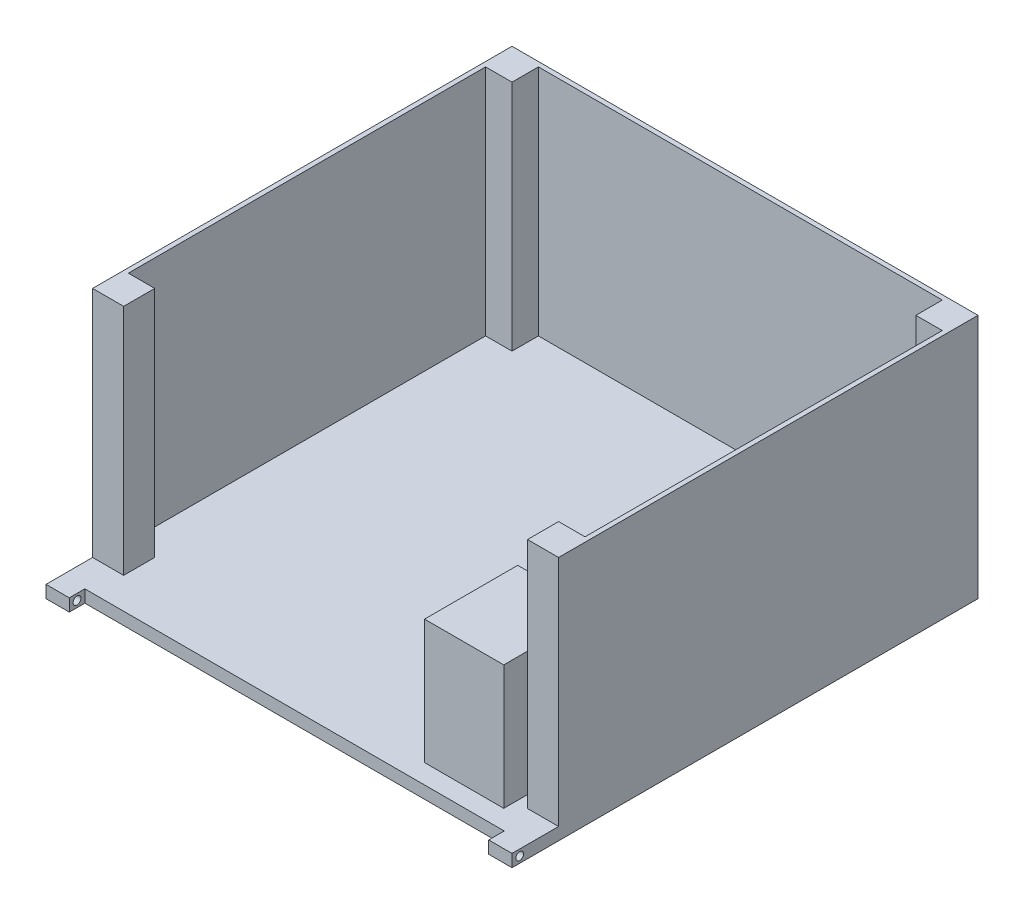
ISO-10303-21;
HEADER;
FILE_DESCRIPTION(('STEP AP214'),'2;1');
FILE_NAME('part.step','',(''),(''),'','','');
FILE_SCHEMA(('AUTOMOTIVE_DESIGN { 1 0 10303 214 1 1 1 1 }'));
ENDSEC;
DATA;
#1=APPLICATION_CONTEXT('core data for automotive mechanical design processes');
#2=APPLICATION_PROTOCOL_DEFINITION('international standard','automotive_design',2000,#1);
#3=PRODUCT_CONTEXT('',#1,'mechanical');
#4=PRODUCT('Part','Part','',(#3));
#5=PRODUCT_RELATED_PRODUCT_CATEGORY('part','',(#4));
#6=PRODUCT_DEFINITION_FORMATION('','',#4);
#7=PRODUCT_DEFINITION_CONTEXT('part definition',#1,'design');
#8=PRODUCT_DEFINITION('design','',#6,#7);
#9=PRODUCT_DEFINITION_SHAPE('','',#8);
#10=(LENGTH_UNIT() NAMED_UNIT(*) SI_UNIT(.MILLI.,.METRE.));
#11=(NAMED_UNIT(*) PLANE_ANGLE_UNIT() SI_UNIT($,.RADIAN.));
#12=(NAMED_UNIT(*) SI_UNIT($,.STERADIAN.) SOLID_ANGLE_UNIT());
#13=UNCERTAINTY_MEASURE_WITH_UNIT(LENGTH_MEASURE(1.E-05),#10,'distance_accuracy_value','');
#14=(GEOMETRIC_REPRESENTATION_CONTEXT(3) GLOBAL_UNCERTAINTY_ASSIGNED_CONTEXT((#13)) GLOBAL_UNIT_ASSIGNED_CONTEXT((#10,
#11,#12)) REPRESENTATION_CONTEXT('',''));
#15=CARTESIAN_POINT('',(0.,0.,0.));
#16=DIRECTION('',(0.,0.,1.));
#17=DIRECTION('',(1.,0.,0.));
#18=AXIS2_PLACEMENT_3D('',#15,#16,#17);
#19=CARTESIAN_POINT('',(0.,8.,0.));
#20=DIRECTION('',(0.,1.,0.));
#21=DIRECTION('',(0.,0.,1.));
#22=AXIS2_PLACEMENT_3D('',#19,#20,#21);
#23=PLANE('',#22);
#24=DIRECTION('',(1.,0.,0.));
#25=VECTOR('',#24,1.);
#26=CARTESIAN_POINT('',(-150.,8.,-130.));
#27=LINE('',#26,#25);
#28=CARTESIAN_POINT('',(-147.,8.,-130.));
#29=VERTEX_POINT('',#28);
#30=CARTESIAN_POINT('',(-130.,8.,-130.));
#31=VERTEX_POINT('',#30);
#32=EDGE_CURVE('E375',#29,#31,#27,.T.);
#33=ORIENTED_EDGE('',*,*,#32,.F.);
#34=DIRECTION('',(0.,0.,-1.));
#35=VECTOR('',#34,1.);
#36=CARTESIAN_POINT('',(-147.,8.,-147.));
#37=LINE('',#36,#35);
#38=CARTESIAN_POINT('',(-147.,8.,100.));
#39=VERTEX_POINT('',#38);
#40=EDGE_CURVE('E243',#39,#29,#37,.T.);
#41=ORIENTED_EDGE('',*,*,#40,.F.);
#42=DIRECTION('',(-1.,0.,0.));
#43=VECTOR('',#42,1.);
#44=CARTESIAN_POINT('',(-150.,8.,100.));
#45=LINE('',#44,#43);
#46=CARTESIAN_POINT('',(-130.,8.,100.));
#47=VERTEX_POINT('',#46);
#48=EDGE_CURVE('E291',#47,#39,#45,.T.);
#49=ORIENTED_EDGE('',*,*,#48,.F.);
#50=DIRECTION('',(0.,0.,-1.));
#51=VECTOR('',#50,1.);
#52=CARTESIAN_POINT('',(-130.,8.,120.));
#53=LINE('',#52,#51);
#54=CARTESIAN_POINT('',(-130.,8.,120.));
#55=VERTEX_POINT('',#54);
#56=EDGE_CURVE('E302',#55,#47,#53,.T.);
#57=ORIENTED_EDGE('',*,*,#56,.F.);
#58=DIRECTION('',(1.,0.,0.));
#59=VECTOR('',#58,1.);
#60=CARTESIAN_POINT('',(-150.,8.,120.));
#61=LINE('',#60,#59);
#62=CARTESIAN_POINT('',(-150.,8.,120.));
#63=VERTEX_POINT('',#62);
#64=EDGE_CURVE('E285',#63,#55,#61,.T.);
#65=ORIENTED_EDGE('',*,*,#64,.F.);
#66=DIRECTION('',(0.,0.,1.));
#67=VECTOR('',#66,1.);
#68=CARTESIAN_POINT('',(-150.,8.,-150.));
#69=LINE('',#68,#67);
#70=CARTESIAN_POINT('',(-150.,8.,150.));
#71=VERTEX_POINT('',#70);
#72=EDGE_CURVE('E416',#63,#71,#69,.T.);
#73=ORIENTED_EDGE('',*,*,#72,.T.);
#74=DIRECTION('',(1.,0.,0.));
#75=VECTOR('',#74,1.);
#76=CARTESIAN_POINT('',(-150.,8.,150.));
#77=LINE('',#76,#75);
#78=CARTESIAN_POINT('',(-135.,8.,150.));
#79=VERTEX_POINT('',#78);
#80=EDGE_CURVE('E420',#71,#79,#77,.T.);
#81=ORIENTED_EDGE('',*,*,#80,.T.);
#82=DIRECTION('',(0.,0.,-1.));
#83=VECTOR('',#82,1.);
#84=CARTESIAN_POINT('',(-135.,8.,140.));
#85=LINE('',#84,#83);
#86=CARTESIAN_POINT('',(-135.,8.,140.));
#87=VERTEX_POINT('',#86);
#88=EDGE_CURVE('E423',#79,#87,#85,.T.);
#89=ORIENTED_EDGE('',*,*,#88,.T.);
#90=DIRECTION('',(1.,0.,0.));
#91=VECTOR('',#90,1.);
#92=CARTESIAN_POINT('',(-135.,8.,140.));
#93=LINE('',#92,#91);
#94=CARTESIAN_POINT('',(135.,8.,140.));
#95=VERTEX_POINT('',#94);
#96=EDGE_CURVE('E426',#87,#95,#93,.T.);
#97=ORIENTED_EDGE('',*,*,#96,.T.);
#98=DIRECTION('',(0.,0.,1.));
#99=VECTOR('',#98,1.);
#100=CARTESIAN_POINT('',(135.,8.,140.));
#101=LINE('',#100,#99);
#102=CARTESIAN_POINT('',(135.,8.,150.));
#103=VERTEX_POINT('',#102);
#104=EDGE_CURVE('E429',#95,#103,#101,.T.);
#105=ORIENTED_EDGE('',*,*,#104,.T.);
#106=DIRECTION('',(1.,0.,0.));
#107=VECTOR('',#106,1.);
#108=CARTESIAN_POINT('',(135.,8.,150.));
#109=LINE('',#108,#107);
#110=CARTESIAN_POINT('',(150.,8.,150.));
#111=VERTEX_POINT('',#110);
#112=EDGE_CURVE('E432',#103,#111,#109,.T.);
#113=ORIENTED_EDGE('',*,*,#112,.T.);
#114=DIRECTION('',(0.,0.,-1.));
#115=VECTOR('',#114,1.);
#116=CARTESIAN_POINT('',(150.,8.,-150.));
#117=LINE('',#116,#115);
#118=CARTESIAN_POINT('',(150.,8.,120.));
#119=VERTEX_POINT('',#118);
#120=EDGE_CURVE('E413',#111,#119,#117,.T.);
#121=ORIENTED_EDGE('',*,*,#120,.T.);
#122=DIRECTION('',(1.,0.,0.));
#123=VECTOR('',#122,1.);
#124=CARTESIAN_POINT('',(150.,8.,120.));
#125=LINE('',#124,#123);
#126=CARTESIAN_POINT('',(130.,8.,120.));
#127=VERTEX_POINT('',#126);
#128=EDGE_CURVE('E325',#127,#119,#125,.T.);
#129=ORIENTED_EDGE('',*,*,#128,.F.);
#130=DIRECTION('',(0.,0.,1.));
#131=VECTOR('',#130,1.);
#132=CARTESIAN_POINT('',(130.,8.,120.));
#133=LINE('',#132,#131);
#134=CARTESIAN_POINT('',(130.,8.,100.));
#135=VERTEX_POINT('',#134);
#136=EDGE_CURVE('E335',#135,#127,#133,.T.);
#137=ORIENTED_EDGE('',*,*,#136,.F.);
#138=DIRECTION('',(-1.,0.,0.));
#139=VECTOR('',#138,1.);
#140=CARTESIAN_POINT('',(150.,8.,100.));
#141=LINE('',#140,#139);
#142=CARTESIAN_POINT('',(147.,8.,100.));
#143=VERTEX_POINT('',#142);
#144=EDGE_CURVE('E320',#143,#135,#141,.T.);
#145=ORIENTED_EDGE('',*,*,#144,.F.);
#146=DIRECTION('',(0.,0.,1.));
#147=VECTOR('',#146,1.);
#148=CARTESIAN_POINT('',(147.,8.,-147.));
#149=LINE('',#148,#147);
#150=CARTESIAN_POINT('',(147.,8.,-130.));
#151=VERTEX_POINT('',#150);
#152=EDGE_CURVE('E256',#151,#143,#149,.T.);
#153=ORIENTED_EDGE('',*,*,#152,.F.);
#154=DIRECTION('',(1.,0.,0.));
#155=VECTOR('',#154,1.);
#156=CARTESIAN_POINT('',(150.,8.,-130.));
#157=LINE('',#156,#155);
#158=CARTESIAN_POINT('',(130.,8.,-130.));
#159=VERTEX_POINT('',#158);
#160=EDGE_CURVE('E358',#159,#151,#157,.T.);
#161=ORIENTED_EDGE('',*,*,#160,.F.);
#162=DIRECTION('',(0.,0.,1.));
#163=VECTOR('',#162,1.);
#164=CARTESIAN_POINT('',(130.,8.,-150.));
#165=LINE('',#164,#163);
#166=CARTESIAN_POINT('',(130.,8.,-147.));
#167=VERTEX_POINT('',#166);
#168=EDGE_CURVE('E353',#167,#159,#165,.T.);
#169=ORIENTED_EDGE('',*,*,#168,.F.);
#170=DIRECTION('',(1.,0.,0.));
#171=VECTOR('',#170,1.);
#172=CARTESIAN_POINT('',(-147.,8.,-147.));
#173=LINE('',#172,#171);
#174=CARTESIAN_POINT('',(-130.,8.,-147.));
#175=VERTEX_POINT('',#174);
#176=EDGE_CURVE('E247',#175,#167,#173,.T.);
#177=ORIENTED_EDGE('',*,*,#176,.F.);
#178=DIRECTION('',(0.,0.,-1.));
#179=VECTOR('',#178,1.);
#180=CARTESIAN_POINT('',(-130.,8.,-150.));
#181=LINE('',#180,#179);
#182=EDGE_CURVE('E380',#31,#175,#181,.T.);
#183=ORIENTED_EDGE('',*,*,#182,.F.);
#184=EDGE_LOOP('',(#33,#41,#49,#57,#65,#73,#81,#89,#97,#105,#113,#121,#129,#137,#145,#153,#161,
#169,#177,#183));
#185=FACE_BOUND('',#184,.T.);
#186=DIRECTION('',(1.,0.,0.));
#187=VECTOR('',#186,1.);
#188=CARTESIAN_POINT('',(71.2296896432998,8.,127.534797700735));
#189=LINE('',#188,#187);
#190=CARTESIAN_POINT('',(71.2296896432998,8.,127.534797700735));
#191=VERTEX_POINT('',#190);
#192=CARTESIAN_POINT('',(122.2296896433,8.,127.534797700735));
#193=VERTEX_POINT('',#192);
#194=EDGE_CURVE('E914',#191,#193,#189,.T.);
#195=ORIENTED_EDGE('',*,*,#194,.F.);
#196=DIRECTION('',(0.,0.,1.));
#197=VECTOR('',#196,1.);
#198=CARTESIAN_POINT('',(71.2296896432998,8.,67.534797700735));
#199=LINE('',#198,#197);
#200=CARTESIAN_POINT('',(71.2296896432998,8.,67.534797700735));
#201=VERTEX_POINT('',#200);
#202=EDGE_CURVE('E240',#201,#191,#199,.T.);
#203=ORIENTED_EDGE('',*,*,#202,.F.);
#204=DIRECTION('',(-1.,0.,0.));
#205=VECTOR('',#204,1.);
#206=CARTESIAN_POINT('',(71.2296896432998,8.,67.534797700735));
#207=LINE('',#206,#205);
#208=CARTESIAN_POINT('',(122.2296896433,8.,67.534797700735));
#209=VERTEX_POINT('',#208);
#210=EDGE_CURVE('E236',#209,#201,#207,.T.);
#211=ORIENTED_EDGE('',*,*,#210,.F.);
#212=DIRECTION('',(0.,0.,-1.));
#213=VECTOR('',#212,1.);
#214=CARTESIAN_POINT('',(122.2296896433,8.,67.534797700735));
#215=LINE('',#214,#213);
#216=EDGE_CURVE('E924',#193,#209,#215,.T.);
#217=ORIENTED_EDGE('',*,*,#216,.F.);
#218=EDGE_LOOP('',(#195,#203,#211,#217));
#219=FACE_BOUND('',#218,.T.);
#220=ADVANCED_FACE('F41',(#185,#219),#23,.T.);
#221=CARTESIAN_POINT('',(-150.,158.,-130.));
#222=DIRECTION('',(0.,0.,-1.));
#223=DIRECTION('',(-1.,0.,0.));
#224=AXIS2_PLACEMENT_3D('',#221,#222,#223);
#225=PLANE('',#224);
#226=DIRECTION('',(0.,1.,0.));
#227=VECTOR('',#226,1.);
#228=CARTESIAN_POINT('',(-147.,158.,-130.));
#229=LINE('',#228,#227);
#230=CARTESIAN_POINT('',(-147.,158.,-130.));
#231=VERTEX_POINT('',#230);
#232=EDGE_CURVE('E269',#29,#231,#229,.T.);
#233=ORIENTED_EDGE('',*,*,#232,.F.);
#234=ORIENTED_EDGE('',*,*,#32,.T.);
#235=DIRECTION('',(0.,-1.,0.));
#236=VECTOR('',#235,1.);
#237=CARTESIAN_POINT('',(-130.,158.,-130.));
#238=LINE('',#237,#236);
#239=CARTESIAN_POINT('',(-130.,158.,-130.));
#240=VERTEX_POINT('',#239);
#241=EDGE_CURVE('E390',#240,#31,#238,.T.);
#242=ORIENTED_EDGE('',*,*,#241,.F.);
#243=DIRECTION('',(1.,0.,0.));
#244=VECTOR('',#243,1.);
#245=CARTESIAN_POINT('',(-150.,158.,-130.));
#246=LINE('',#245,#244);
#247=EDGE_CURVE('E379',#231,#240,#246,.T.);
#248=ORIENTED_EDGE('',*,*,#247,.F.);
#249=EDGE_LOOP('',(#233,#234,#242,#248));
#250=FACE_BOUND('',#249,.T.);
#251=ADVANCED_FACE('F512',(#250),#225,.F.);
#252=CARTESIAN_POINT('',(-130.,158.,-150.));
#253=DIRECTION('',(-1.,0.,0.));
#254=DIRECTION('',(0.,0.,1.));
#255=AXIS2_PLACEMENT_3D('',#252,#253,#254);
#256=PLANE('',#255);
#257=DIRECTION('',(0.,-1.,0.));
#258=VECTOR('',#257,1.);
#259=CARTESIAN_POINT('',(-130.,158.,-147.));
#260=LINE('',#259,#258);
#261=CARTESIAN_POINT('',(-130.,158.,-147.));
#262=VERTEX_POINT('',#261);
#263=EDGE_CURVE('E282',#262,#175,#260,.T.);
#264=ORIENTED_EDGE('',*,*,#263,.F.);
#265=DIRECTION('',(0.,0.,-1.));
#266=VECTOR('',#265,1.);
#267=CARTESIAN_POINT('',(-130.,158.,-150.));
#268=LINE('',#267,#266);
#269=EDGE_CURVE('E383',#240,#262,#268,.T.);
#270=ORIENTED_EDGE('',*,*,#269,.F.);
#271=ORIENTED_EDGE('',*,*,#241,.T.);
#272=ORIENTED_EDGE('',*,*,#182,.T.);
#273=EDGE_LOOP('',(#264,#270,#271,#272));
#274=FACE_BOUND('',#273,.T.);
#275=ADVANCED_FACE('F519',(#274),#256,.F.);
#276=CARTESIAN_POINT('',(130.,158.,-150.));
#277=DIRECTION('',(1.,0.,0.));
#278=DIRECTION('',(0.,0.,-1.));
#279=AXIS2_PLACEMENT_3D('',#276,#277,#278);
#280=PLANE('',#279);
#281=DIRECTION('',(0.,1.,0.));
#282=VECTOR('',#281,1.);
#283=CARTESIAN_POINT('',(130.,158.,-147.));
#284=LINE('',#283,#282);
#285=CARTESIAN_POINT('',(130.,158.,-147.));
#286=VERTEX_POINT('',#285);
#287=EDGE_CURVE('E279',#167,#286,#284,.T.);
#288=ORIENTED_EDGE('',*,*,#287,.F.);
#289=ORIENTED_EDGE('',*,*,#168,.T.);
#290=DIRECTION('',(0.,-1.,0.));
#291=VECTOR('',#290,1.);
#292=CARTESIAN_POINT('',(130.,158.,-130.));
#293=LINE('',#292,#291);
#294=CARTESIAN_POINT('',(130.,158.,-130.));
#295=VERTEX_POINT('',#294);
#296=EDGE_CURVE('E366',#295,#159,#293,.T.);
#297=ORIENTED_EDGE('',*,*,#296,.F.);
#298=DIRECTION('',(0.,0.,1.));
#299=VECTOR('',#298,1.);
#300=CARTESIAN_POINT('',(130.,158.,-150.));
#301=LINE('',#300,#299);
#302=EDGE_CURVE('E354',#286,#295,#301,.T.);
#303=ORIENTED_EDGE('',*,*,#302,.F.);
#304=EDGE_LOOP('',(#288,#289,#297,#303));
#305=FACE_BOUND('',#304,.T.);
#306=ADVANCED_FACE('F612',(#305),#280,.F.);
#307=CARTESIAN_POINT('',(150.,158.,-130.));
#308=DIRECTION('',(0.,0.,-1.));
#309=DIRECTION('',(-1.,0.,0.));
#310=AXIS2_PLACEMENT_3D('',#307,#308,#309);
#311=PLANE('',#310);
#312=DIRECTION('',(0.,-1.,0.));
#313=VECTOR('',#312,1.);
#314=CARTESIAN_POINT('',(147.,158.,-130.));
#315=LINE('',#314,#313);
#316=CARTESIAN_POINT('',(147.,158.,-130.));
#317=VERTEX_POINT('',#316);
#318=EDGE_CURVE('E276',#317,#151,#315,.T.);
#319=ORIENTED_EDGE('',*,*,#318,.F.);
#320=DIRECTION('',(1.,0.,0.));
#321=VECTOR('',#320,1.);
#322=CARTESIAN_POINT('',(150.,158.,-130.));
#323=LINE('',#322,#321);
#324=EDGE_CURVE('E357',#295,#317,#323,.T.);
#325=ORIENTED_EDGE('',*,*,#324,.F.);
#326=ORIENTED_EDGE('',*,*,#296,.T.);
#327=ORIENTED_EDGE('',*,*,#160,.T.);
#328=EDGE_LOOP('',(#319,#325,#326,#327));
#329=FACE_BOUND('',#328,.T.);
#330=ADVANCED_FACE('F617',(#329),#311,.F.);
#331=CARTESIAN_POINT('',(150.,158.,100.));
#332=DIRECTION('',(0.,0.,1.));
#333=DIRECTION('',(1.,0.,0.));
#334=AXIS2_PLACEMENT_3D('',#331,#332,#333);
#335=PLANE('',#334);
#336=DIRECTION('',(0.,1.,0.));
#337=VECTOR('',#336,1.);
#338=CARTESIAN_POINT('',(147.,158.,100.));
#339=LINE('',#338,#337);
#340=CARTESIAN_POINT('',(147.,158.,100.));
#341=VERTEX_POINT('',#340);
#342=EDGE_CURVE('E272',#143,#341,#339,.T.);
#343=ORIENTED_EDGE('',*,*,#342,.F.);
#344=ORIENTED_EDGE('',*,*,#144,.T.);
#345=DIRECTION('',(0.,-1.,0.));
#346=VECTOR('',#345,1.);
#347=CARTESIAN_POINT('',(130.,158.,100.));
#348=LINE('',#347,#346);
#349=CARTESIAN_POINT('',(130.,158.,100.));
#350=VERTEX_POINT('',#349);
#351=EDGE_CURVE('E349',#350,#135,#348,.T.);
#352=ORIENTED_EDGE('',*,*,#351,.F.);
#353=DIRECTION('',(-1.,0.,0.));
#354=VECTOR('',#353,1.);
#355=CARTESIAN_POINT('',(150.,158.,100.));
#356=LINE('',#355,#354);
#357=EDGE_CURVE('E321',#341,#350,#356,.T.);
#358=ORIENTED_EDGE('',*,*,#357,.F.);
#359=EDGE_LOOP('',(#343,#344,#352,#358));
#360=FACE_BOUND('',#359,.T.);
#361=ADVANCED_FACE('F624',(#360),#335,.F.);
#362=CARTESIAN_POINT('',(-150.,158.,100.));
#363=DIRECTION('',(0.,0.,1.));
#364=DIRECTION('',(1.,0.,0.));
#365=AXIS2_PLACEMENT_3D('',#362,#363,#364);
#366=PLANE('',#365);
#367=DIRECTION('',(0.,-1.,0.));
#368=VECTOR('',#367,1.);
#369=CARTESIAN_POINT('',(-147.,158.,100.));
#370=LINE('',#369,#368);
#371=CARTESIAN_POINT('',(-147.,158.,100.));
#372=VERTEX_POINT('',#371);
#373=EDGE_CURVE('E261',#372,#39,#370,.T.);
#374=ORIENTED_EDGE('',*,*,#373,.F.);
#375=DIRECTION('',(-1.,0.,0.));
#376=VECTOR('',#375,1.);
#377=CARTESIAN_POINT('',(-150.,158.,100.));
#378=LINE('',#377,#376);
#379=CARTESIAN_POINT('',(-130.,158.,100.));
#380=VERTEX_POINT('',#379);
#381=EDGE_CURVE('E294',#380,#372,#378,.T.);
#382=ORIENTED_EDGE('',*,*,#381,.F.);
#383=DIRECTION('',(0.,-1.,0.));
#384=VECTOR('',#383,1.);
#385=CARTESIAN_POINT('',(-130.,158.,100.));
#386=LINE('',#385,#384);
#387=EDGE_CURVE('E312',#380,#47,#386,.T.);
#388=ORIENTED_EDGE('',*,*,#387,.T.);
#389=ORIENTED_EDGE('',*,*,#48,.T.);
#390=EDGE_LOOP('',(#374,#382,#388,#389));
#391=FACE_BOUND('',#390,.T.);
#392=ADVANCED_FACE('F550',(#391),#366,.F.);
#393=CARTESIAN_POINT('',(150.,8.,-150.));
#394=DIRECTION('',(-1.,0.,0.));
#395=DIRECTION('',(0.,0.,1.));
#396=AXIS2_PLACEMENT_3D('',#393,#394,#395);
#397=PLANE('',#396);
#398=DIRECTION('',(0.,0.,-1.));
#399=VECTOR('',#398,1.);
#400=CARTESIAN_POINT('',(150.,158.,-150.));
#401=LINE('',#400,#399);
#402=CARTESIAN_POINT('',(150.,158.,120.));
#403=VERTEX_POINT('',#402);
#404=CARTESIAN_POINT('',(150.,158.,-150.));
#405=VERTEX_POINT('',#404);
#406=EDGE_CURVE('E362',#403,#405,#401,.T.);
#407=ORIENTED_EDGE('',*,*,#406,.F.);
#408=DIRECTION('',(0.,-1.,0.));
#409=VECTOR('',#408,1.);
#410=CARTESIAN_POINT('',(150.,158.,120.));
#411=LINE('',#410,#409);
#412=EDGE_CURVE('E332',#403,#119,#411,.T.);
#413=ORIENTED_EDGE('',*,*,#412,.T.);
#414=ORIENTED_EDGE('',*,*,#120,.F.);
#415=DIRECTION('',(0.,-1.,0.));
#416=VECTOR('',#415,1.);
#417=CARTESIAN_POINT('',(150.,8.,150.));
#418=LINE('',#417,#416);
#419=CARTESIAN_POINT('',(150.,0.,150.));
#420=VERTEX_POINT('',#419);
#421=EDGE_CURVE('E435',#111,#420,#418,.T.);
#422=ORIENTED_EDGE('',*,*,#421,.T.);
#423=DIRECTION('',(0.,0.,-1.));
#424=VECTOR('',#423,1.);
#425=CARTESIAN_POINT('',(150.,0.,-150.));
#426=LINE('',#425,#424);
#427=CARTESIAN_POINT('',(150.,0.,-150.));
#428=VERTEX_POINT('',#427);
#429=EDGE_CURVE('E412',#420,#428,#426,.T.);
#430=ORIENTED_EDGE('',*,*,#429,.T.);
#431=DIRECTION('',(0.,-1.,0.));
#432=VECTOR('',#431,1.);
#433=CARTESIAN_POINT('',(150.,8.,-150.));
#434=LINE('',#433,#432);
#435=EDGE_CURVE('E50',#405,#428,#434,.T.);
#436=ORIENTED_EDGE('',*,*,#435,.F.);
#437=EDGE_LOOP('',(#407,#413,#414,#422,#430,#436));
#438=FACE_BOUND('',#437,.T.);
#439=CARTESIAN_POINT('',(150.,4.,145.033528282622));
#440=DIRECTION('',(1.,0.,0.));
#441=DIRECTION('',(0.,0.,-1.));
#442=AXIS2_PLACEMENT_3D('',#439,#440,#441);
#443=CIRCLE('',#442,2.5);
#444=CARTESIAN_POINT('',(150.,4.,142.533528282622));
#445=VERTEX_POINT('',#444);
#446=EDGE_CURVE('E399',#445,#445,#443,.T.);
#447=ORIENTED_EDGE('',*,*,#446,.F.);
#448=EDGE_LOOP('',(#447));
#449=FACE_BOUND('',#448,.T.);
#450=ADVANCED_FACE('F43',(#438,#449),#397,.F.);
#451=CARTESIAN_POINT('',(-150.,8.,-150.));
#452=DIRECTION('',(0.,0.,1.));
#453=DIRECTION('',(1.,0.,0.));
#454=AXIS2_PLACEMENT_3D('',#451,#452,#453);
#455=PLANE('',#454);
#456=DIRECTION('',(-1.,0.,0.));
#457=VECTOR('',#456,1.);
#458=CARTESIAN_POINT('',(-150.,158.,-150.));
#459=LINE('',#458,#457);
#460=CARTESIAN_POINT('',(-150.,158.,-150.));
#461=VERTEX_POINT('',#460);
#462=EDGE_CURVE('E386',#405,#461,#459,.T.);
#463=ORIENTED_EDGE('',*,*,#462,.F.);
#464=ORIENTED_EDGE('',*,*,#435,.T.);
#465=DIRECTION('',(-1.,0.,0.));
#466=VECTOR('',#465,1.);
#467=CARTESIAN_POINT('',(-150.,0.,-150.));
#468=LINE('',#467,#466);
#469=CARTESIAN_POINT('',(-150.,0.,-150.));
#470=VERTEX_POINT('',#469);
#471=EDGE_CURVE('E439',#428,#470,#468,.T.);
#472=ORIENTED_EDGE('',*,*,#471,.T.);
#473=DIRECTION('',(0.,-1.,0.));
#474=VECTOR('',#473,1.);
#475=CARTESIAN_POINT('',(-150.,8.,-150.));
#476=LINE('',#475,#474);
#477=EDGE_CURVE('E483',#461,#470,#476,.T.);
#478=ORIENTED_EDGE('',*,*,#477,.F.);
#479=EDGE_LOOP('',(#463,#464,#472,#478));
#480=FACE_BOUND('',#479,.T.);
#481=ADVANCED_FACE('F543',(#480),#455,.F.);
#482=CARTESIAN_POINT('',(-150.,8.,-150.));
#483=DIRECTION('',(1.,0.,0.));
#484=DIRECTION('',(0.,0.,-1.));
#485=AXIS2_PLACEMENT_3D('',#482,#483,#484);
#486=PLANE('',#485);
#487=DIRECTION('',(0.,-1.,0.));
#488=VECTOR('',#487,1.);
#489=CARTESIAN_POINT('',(-150.,158.,120.));
#490=LINE('',#489,#488);
#491=CARTESIAN_POINT('',(-150.,158.,120.));
#492=VERTEX_POINT('',#491);
#493=EDGE_CURVE('E298',#492,#63,#490,.T.);
#494=ORIENTED_EDGE('',*,*,#493,.F.);
#495=DIRECTION('',(0.,0.,1.));
#496=VECTOR('',#495,1.);
#497=CARTESIAN_POINT('',(-150.,158.,-150.));
#498=LINE('',#497,#496);
#499=EDGE_CURVE('E376',#461,#492,#498,.T.);
#500=ORIENTED_EDGE('',*,*,#499,.F.);
#501=ORIENTED_EDGE('',*,*,#477,.T.);
#502=DIRECTION('',(0.,0.,1.));
#503=VECTOR('',#502,1.);
#504=CARTESIAN_POINT('',(-150.,0.,-150.));
#505=LINE('',#504,#503);
#506=CARTESIAN_POINT('',(-150.,0.,150.));
#507=VERTEX_POINT('',#506);
#508=EDGE_CURVE('E443',#470,#507,#505,.T.);
#509=ORIENTED_EDGE('',*,*,#508,.T.);
#510=DIRECTION('',(0.,-1.,0.));
#511=VECTOR('',#510,1.);
#512=CARTESIAN_POINT('',(-150.,8.,150.));
#513=LINE('',#512,#511);
#514=EDGE_CURVE('E479',#71,#507,#513,.T.);
#515=ORIENTED_EDGE('',*,*,#514,.F.);
#516=ORIENTED_EDGE('',*,*,#72,.F.);
#517=EDGE_LOOP('',(#494,#500,#501,#509,#515,#516));
#518=FACE_BOUND('',#517,.T.);
#519=CARTESIAN_POINT('',(-150.,4.,145.033528282622));
#520=DIRECTION('',(1.,0.,0.));
#521=DIRECTION('',(0.,0.,-1.));
#522=AXIS2_PLACEMENT_3D('',#519,#520,#521);
#523=CIRCLE('',#522,2.5);
#524=CARTESIAN_POINT('',(-150.,4.,142.533528282622));
#525=VERTEX_POINT('',#524);
#526=EDGE_CURVE('E403',#525,#525,#523,.T.);
#527=ORIENTED_EDGE('',*,*,#526,.T.);
#528=EDGE_LOOP('',(#527));
#529=FACE_BOUND('',#528,.T.);
#530=ADVANCED_FACE('F540',(#518,#529),#486,.F.);
#531=CARTESIAN_POINT('',(-150.,8.,150.));
#532=DIRECTION('',(0.,0.,-1.));
#533=DIRECTION('',(-1.,0.,0.));
#534=AXIS2_PLACEMENT_3D('',#531,#532,#533);
#535=PLANE('',#534);
#536=DIRECTION('',(1.,0.,0.));
#537=VECTOR('',#536,1.);
#538=CARTESIAN_POINT('',(-150.,0.,150.));
#539=LINE('',#538,#537);
#540=CARTESIAN_POINT('',(-135.,0.,150.));
#541=VERTEX_POINT('',#540);
#542=EDGE_CURVE('E446',#507,#541,#539,.T.);
#543=ORIENTED_EDGE('',*,*,#542,.T.);
#544=DIRECTION('',(0.,-1.,0.));
#545=VECTOR('',#544,1.);
#546=CARTESIAN_POINT('',(-135.,8.,150.));
#547=LINE('',#546,#545);
#548=EDGE_CURVE('E475',#79,#541,#547,.T.);
#549=ORIENTED_EDGE('',*,*,#548,.F.);
#550=ORIENTED_EDGE('',*,*,#80,.F.);
#551=ORIENTED_EDGE('',*,*,#514,.T.);
#552=EDGE_LOOP('',(#543,#549,#550,#551));
#553=FACE_BOUND('',#552,.T.);
#554=ADVANCED_FACE('F536',(#553),#535,.F.);
#555=CARTESIAN_POINT('',(-135.,8.,140.));
#556=DIRECTION('',(-1.,0.,0.));
#557=DIRECTION('',(0.,0.,1.));
#558=AXIS2_PLACEMENT_3D('',#555,#556,#557);
#559=PLANE('',#558);
#560=CARTESIAN_POINT('',(-135.,4.,145.033528282622));
#561=DIRECTION('',(-1.,0.,0.));
#562=DIRECTION('',(0.,0.,1.));
#563=AXIS2_PLACEMENT_3D('',#560,#561,#562);
#564=CIRCLE('',#563,2.5);
#565=CARTESIAN_POINT('',(-135.,4.,147.533528282622));
#566=VERTEX_POINT('',#565);
#567=EDGE_CURVE('E408',#566,#566,#564,.T.);
#568=ORIENTED_EDGE('',*,*,#567,.T.);
#569=EDGE_LOOP('',(#568));
#570=FACE_BOUND('',#569,.T.);
#571=DIRECTION('',(0.,0.,-1.));
#572=VECTOR('',#571,1.);
#573=CARTESIAN_POINT('',(-135.,0.,140.));
#574=LINE('',#573,#572);
#575=CARTESIAN_POINT('',(-135.,0.,140.));
#576=VERTEX_POINT('',#575);
#577=EDGE_CURVE('E449',#541,#576,#574,.T.);
#578=ORIENTED_EDGE('',*,*,#577,.T.);
#579=DIRECTION('',(0.,-1.,0.));
#580=VECTOR('',#579,1.);
#581=CARTESIAN_POINT('',(-135.,8.,140.));
#582=LINE('',#581,#580);
#583=EDGE_CURVE('E471',#87,#576,#582,.T.);
#584=ORIENTED_EDGE('',*,*,#583,.F.);
#585=ORIENTED_EDGE('',*,*,#88,.F.);
#586=ORIENTED_EDGE('',*,*,#548,.T.);
#587=EDGE_LOOP('',(#578,#584,#585,#586));
#588=FACE_BOUND('',#587,.T.);
#589=ADVANCED_FACE('F532',(#570,#588),#559,.F.);
#590=CARTESIAN_POINT('',(-135.,8.,140.));
#591=DIRECTION('',(0.,0.,-1.));
#592=DIRECTION('',(-1.,0.,0.));
#593=AXIS2_PLACEMENT_3D('',#590,#591,#592);
#594=PLANE('',#593);
#595=DIRECTION('',(1.,0.,0.));
#596=VECTOR('',#595,1.);
#597=CARTESIAN_POINT('',(-135.,0.,140.));
#598=LINE('',#597,#596);
#599=CARTESIAN_POINT('',(135.,0.,140.));
#600=VERTEX_POINT('',#599);
#601=EDGE_CURVE('E452',#576,#600,#598,.T.);
#602=ORIENTED_EDGE('',*,*,#601,.T.);
#603=DIRECTION('',(0.,-1.,0.));
#604=VECTOR('',#603,1.);
#605=CARTESIAN_POINT('',(135.,8.,140.));
#606=LINE('',#605,#604);
#607=EDGE_CURVE('E467',#95,#600,#606,.T.);
#608=ORIENTED_EDGE('',*,*,#607,.F.);
#609=ORIENTED_EDGE('',*,*,#96,.F.);
#610=ORIENTED_EDGE('',*,*,#583,.T.);
#611=EDGE_LOOP('',(#602,#608,#609,#610));
#612=FACE_BOUND('',#611,.T.);
#613=ADVANCED_FACE('F529',(#612),#594,.F.);
#614=CARTESIAN_POINT('',(135.,8.,140.));
#615=DIRECTION('',(1.,0.,0.));
#616=DIRECTION('',(0.,0.,-1.));
#617=AXIS2_PLACEMENT_3D('',#614,#615,#616);
#618=PLANE('',#617);
#619=CARTESIAN_POINT('',(135.,4.,145.033528282622));
#620=DIRECTION('',(1.,0.,0.));
#621=DIRECTION('',(0.,0.,-1.));
#622=AXIS2_PLACEMENT_3D('',#619,#620,#621);
#623=CIRCLE('',#622,2.5);
#624=CARTESIAN_POINT('',(135.,4.,142.533528282622));
#625=VERTEX_POINT('',#624);
#626=EDGE_CURVE('E407',#625,#625,#623,.T.);
#627=ORIENTED_EDGE('',*,*,#626,.T.);
#628=EDGE_LOOP('',(#627));
#629=FACE_BOUND('',#628,.T.);
#630=DIRECTION('',(0.,0.,1.));
#631=VECTOR('',#630,1.);
#632=CARTESIAN_POINT('',(135.,0.,140.));
#633=LINE('',#632,#631);
#634=CARTESIAN_POINT('',(135.,0.,150.));
#635=VERTEX_POINT('',#634);
#636=EDGE_CURVE('E455',#600,#635,#633,.T.);
#637=ORIENTED_EDGE('',*,*,#636,.T.);
#638=DIRECTION('',(0.,-1.,0.));
#639=VECTOR('',#638,1.);
#640=CARTESIAN_POINT('',(135.,8.,150.));
#641=LINE('',#640,#639);
#642=EDGE_CURVE('E463',#103,#635,#641,.T.);
#643=ORIENTED_EDGE('',*,*,#642,.F.);
#644=ORIENTED_EDGE('',*,*,#104,.F.);
#645=ORIENTED_EDGE('',*,*,#607,.T.);
#646=EDGE_LOOP('',(#637,#643,#644,#645));
#647=FACE_BOUND('',#646,.T.);
#648=ADVANCED_FACE('F491',(#629,#647),#618,.F.);
#649=CARTESIAN_POINT('',(135.,8.,150.));
#650=DIRECTION('',(0.,0.,-1.));
#651=DIRECTION('',(-1.,0.,0.));
#652=AXIS2_PLACEMENT_3D('',#649,#650,#651);
#653=PLANE('',#652);
#654=DIRECTION('',(1.,0.,0.));
#655=VECTOR('',#654,1.);
#656=CARTESIAN_POINT('',(135.,0.,150.));
#657=LINE('',#656,#655);
#658=EDGE_CURVE('E417',#635,#420,#657,.T.);
#659=ORIENTED_EDGE('',*,*,#658,.T.);
#660=ORIENTED_EDGE('',*,*,#421,.F.);
#661=ORIENTED_EDGE('',*,*,#112,.F.);
#662=ORIENTED_EDGE('',*,*,#642,.T.);
#663=EDGE_LOOP('',(#659,#660,#661,#662));
#664=FACE_BOUND('',#663,.T.);
#665=ADVANCED_FACE('F506',(#664),#653,.F.);
#666=CARTESIAN_POINT('',(0.,0.,0.));
#667=DIRECTION('',(0.,1.,0.));
#668=DIRECTION('',(0.,0.,1.));
#669=AXIS2_PLACEMENT_3D('',#666,#667,#668);
#670=PLANE('',#669);
#671=ORIENTED_EDGE('',*,*,#429,.F.);
#672=ORIENTED_EDGE('',*,*,#658,.F.);
#673=ORIENTED_EDGE('',*,*,#636,.F.);
#674=ORIENTED_EDGE('',*,*,#601,.F.);
#675=ORIENTED_EDGE('',*,*,#577,.F.);
#676=ORIENTED_EDGE('',*,*,#542,.F.);
#677=ORIENTED_EDGE('',*,*,#508,.F.);
#678=ORIENTED_EDGE('',*,*,#471,.F.);
#679=EDGE_LOOP('',(#671,#672,#673,#674,#675,#676,#677,#678));
#680=FACE_BOUND('',#679,.T.);
#681=ADVANCED_FACE('F497',(#680),#670,.F.);
#682=CARTESIAN_POINT('',(-150.,4.,145.033528282622));
#683=DIRECTION('',(1.,0.,0.));
#684=DIRECTION('',(0.,0.,-1.));
#685=AXIS2_PLACEMENT_3D('',#682,#683,#684);
#686=CYLINDRICAL_SURFACE('',#685,2.5);
#687=ORIENTED_EDGE('',*,*,#446,.T.);
#688=EDGE_LOOP('',(#687));
#689=FACE_BOUND('',#688,.T.);
#690=ORIENTED_EDGE('',*,*,#626,.F.);
#691=EDGE_LOOP('',(#690));
#692=FACE_BOUND('',#691,.T.);
#693=ADVANCED_FACE('F494',(#689,#692),#686,.F.);
#694=ORIENTED_EDGE('',*,*,#526,.F.);
#695=EDGE_LOOP('',(#694));
#696=FACE_BOUND('',#695,.T.);
#697=ORIENTED_EDGE('',*,*,#567,.F.);
#698=EDGE_LOOP('',(#697));
#699=FACE_BOUND('',#698,.T.);
#700=ADVANCED_FACE('F496',(#696,#699),#686,.F.);
#701=CARTESIAN_POINT('',(0.,158.,0.));
#702=DIRECTION('',(0.,1.,0.));
#703=DIRECTION('',(0.,0.,1.));
#704=AXIS2_PLACEMENT_3D('',#701,#702,#703);
#705=PLANE('',#704);
#706=ORIENTED_EDGE('',*,*,#499,.T.);
#707=DIRECTION('',(1.,0.,0.));
#708=VECTOR('',#707,1.);
#709=CARTESIAN_POINT('',(-150.,158.,120.));
#710=LINE('',#709,#708);
#711=CARTESIAN_POINT('',(-130.,158.,120.));
#712=VERTEX_POINT('',#711);
#713=EDGE_CURVE('E286',#492,#712,#710,.T.);
#714=ORIENTED_EDGE('',*,*,#713,.T.);
#715=DIRECTION('',(0.,0.,-1.));
#716=VECTOR('',#715,1.);
#717=CARTESIAN_POINT('',(-130.,158.,120.));
#718=LINE('',#717,#716);
#719=EDGE_CURVE('E290',#712,#380,#718,.T.);
#720=ORIENTED_EDGE('',*,*,#719,.T.);
#721=ORIENTED_EDGE('',*,*,#381,.T.);
#722=DIRECTION('',(0.,0.,-1.));
#723=VECTOR('',#722,1.);
#724=CARTESIAN_POINT('',(-147.,158.,-147.));
#725=LINE('',#724,#723);
#726=EDGE_CURVE('E252',#372,#231,#725,.T.);
#727=ORIENTED_EDGE('',*,*,#726,.T.);
#728=ORIENTED_EDGE('',*,*,#247,.T.);
#729=ORIENTED_EDGE('',*,*,#269,.T.);
#730=DIRECTION('',(1.,0.,0.));
#731=VECTOR('',#730,1.);
#732=CARTESIAN_POINT('',(-147.,158.,-147.));
#733=LINE('',#732,#731);
#734=EDGE_CURVE('E65',#262,#286,#733,.T.);
#735=ORIENTED_EDGE('',*,*,#734,.T.);
#736=ORIENTED_EDGE('',*,*,#302,.T.);
#737=ORIENTED_EDGE('',*,*,#324,.T.);
#738=DIRECTION('',(0.,0.,1.));
#739=VECTOR('',#738,1.);
#740=CARTESIAN_POINT('',(147.,158.,-147.));
#741=LINE('',#740,#739);
#742=EDGE_CURVE('E259',#317,#341,#741,.T.);
#743=ORIENTED_EDGE('',*,*,#742,.T.);
#744=ORIENTED_EDGE('',*,*,#357,.T.);
#745=DIRECTION('',(0.,0.,1.));
#746=VECTOR('',#745,1.);
#747=CARTESIAN_POINT('',(130.,158.,120.));
#748=LINE('',#747,#746);
#749=CARTESIAN_POINT('',(130.,158.,120.));
#750=VERTEX_POINT('',#749);
#751=EDGE_CURVE('E324',#350,#750,#748,.T.);
#752=ORIENTED_EDGE('',*,*,#751,.T.);
#753=DIRECTION('',(1.,0.,0.));
#754=VECTOR('',#753,1.);
#755=CARTESIAN_POINT('',(150.,158.,120.));
#756=LINE('',#755,#754);
#757=EDGE_CURVE('E328',#750,#403,#756,.T.);
#758=ORIENTED_EDGE('',*,*,#757,.T.);
#759=ORIENTED_EDGE('',*,*,#406,.T.);
#760=ORIENTED_EDGE('',*,*,#462,.T.);
#761=EDGE_LOOP('',(#706,#714,#720,#721,#727,#728,#729,#735,#736,#737,#743,#744,#752,#758,#759,#760));
#762=FACE_BOUND('',#761,.T.);
#763=ADVANCED_FACE('F504',(#762),#705,.T.);
#764=CARTESIAN_POINT('',(130.,158.,120.));
#765=DIRECTION('',(1.,0.,0.));
#766=DIRECTION('',(0.,0.,-1.));
#767=AXIS2_PLACEMENT_3D('',#764,#765,#766);
#768=PLANE('',#767);
#769=ORIENTED_EDGE('',*,*,#136,.T.);
#770=DIRECTION('',(0.,-1.,0.));
#771=VECTOR('',#770,1.);
#772=CARTESIAN_POINT('',(130.,158.,120.));
#773=LINE('',#772,#771);
#774=EDGE_CURVE('E345',#750,#127,#773,.T.);
#775=ORIENTED_EDGE('',*,*,#774,.F.);
#776=ORIENTED_EDGE('',*,*,#751,.F.);
#777=ORIENTED_EDGE('',*,*,#351,.T.);
#778=EDGE_LOOP('',(#769,#775,#776,#777));
#779=FACE_BOUND('',#778,.T.);
#780=ADVANCED_FACE('F627',(#779),#768,.F.);
#781=CARTESIAN_POINT('',(150.,158.,120.));
#782=DIRECTION('',(0.,0.,-1.));
#783=DIRECTION('',(-1.,0.,0.));
#784=AXIS2_PLACEMENT_3D('',#781,#782,#783);
#785=PLANE('',#784);
#786=ORIENTED_EDGE('',*,*,#128,.T.);
#787=ORIENTED_EDGE('',*,*,#412,.F.);
#788=ORIENTED_EDGE('',*,*,#757,.F.);
#789=ORIENTED_EDGE('',*,*,#774,.T.);
#790=EDGE_LOOP('',(#786,#787,#788,#789));
#791=FACE_BOUND('',#790,.T.);
#792=ADVANCED_FACE('F562',(#791),#785,.F.);
#793=CARTESIAN_POINT('',(-150.,158.,120.));
#794=DIRECTION('',(0.,0.,-1.));
#795=DIRECTION('',(-1.,0.,0.));
#796=AXIS2_PLACEMENT_3D('',#793,#794,#795);
#797=PLANE('',#796);
#798=ORIENTED_EDGE('',*,*,#64,.T.);
#799=DIRECTION('',(0.,-1.,0.));
#800=VECTOR('',#799,1.);
#801=CARTESIAN_POINT('',(-130.,158.,120.));
#802=LINE('',#801,#800);
#803=EDGE_CURVE('E316',#712,#55,#802,.T.);
#804=ORIENTED_EDGE('',*,*,#803,.F.);
#805=ORIENTED_EDGE('',*,*,#713,.F.);
#806=ORIENTED_EDGE('',*,*,#493,.T.);
#807=EDGE_LOOP('',(#798,#804,#805,#806));
#808=FACE_BOUND('',#807,.T.);
#809=ADVANCED_FACE('F586',(#808),#797,.F.);
#810=CARTESIAN_POINT('',(-130.,158.,120.));
#811=DIRECTION('',(-1.,0.,0.));
#812=DIRECTION('',(0.,0.,1.));
#813=AXIS2_PLACEMENT_3D('',#810,#811,#812);
#814=PLANE('',#813);
#815=ORIENTED_EDGE('',*,*,#56,.T.);
#816=ORIENTED_EDGE('',*,*,#387,.F.);
#817=ORIENTED_EDGE('',*,*,#719,.F.);
#818=ORIENTED_EDGE('',*,*,#803,.T.);
#819=EDGE_LOOP('',(#815,#816,#817,#818));
#820=FACE_BOUND('',#819,.T.);
#821=ADVANCED_FACE('F590',(#820),#814,.F.);
#822=CARTESIAN_POINT('',(-147.,158.,-147.));
#823=DIRECTION('',(-1.,0.,0.));
#824=DIRECTION('',(0.,0.,1.));
#825=AXIS2_PLACEMENT_3D('',#822,#823,#824);
#826=PLANE('',#825);
#827=ORIENTED_EDGE('',*,*,#40,.T.);
#828=ORIENTED_EDGE('',*,*,#232,.T.);
#829=ORIENTED_EDGE('',*,*,#726,.F.);
#830=ORIENTED_EDGE('',*,*,#373,.T.);
#831=EDGE_LOOP('',(#827,#828,#829,#830));
#832=FACE_BOUND('',#831,.T.);
#833=ADVANCED_FACE('F595',(#832),#826,.F.);
#834=CARTESIAN_POINT('',(147.,158.,-147.));
#835=DIRECTION('',(1.,0.,0.));
#836=DIRECTION('',(0.,0.,-1.));
#837=AXIS2_PLACEMENT_3D('',#834,#835,#836);
#838=PLANE('',#837);
#839=ORIENTED_EDGE('',*,*,#742,.F.);
#840=ORIENTED_EDGE('',*,*,#318,.T.);
#841=ORIENTED_EDGE('',*,*,#152,.T.);
#842=ORIENTED_EDGE('',*,*,#342,.T.);
#843=EDGE_LOOP('',(#839,#840,#841,#842));
#844=FACE_BOUND('',#843,.T.);
#845=ADVANCED_FACE('F619',(#844),#838,.F.);
#846=CARTESIAN_POINT('',(-147.,158.,-147.));
#847=DIRECTION('',(0.,0.,-1.));
#848=DIRECTION('',(-1.,0.,0.));
#849=AXIS2_PLACEMENT_3D('',#846,#847,#848);
#850=PLANE('',#849);
#851=ORIENTED_EDGE('',*,*,#734,.F.);
#852=ORIENTED_EDGE('',*,*,#263,.T.);
#853=ORIENTED_EDGE('',*,*,#176,.T.);
#854=ORIENTED_EDGE('',*,*,#287,.T.);
#855=EDGE_LOOP('',(#851,#852,#853,#854));
#856=FACE_BOUND('',#855,.T.);
#857=ADVANCED_FACE('F605',(#856),#850,.F.);
#858=CARTESIAN_POINT('',(71.2296896432998,88.,67.534797700735));
#859=DIRECTION('',(1.,0.,0.));
#860=DIRECTION('',(0.,0.,-1.));
#861=AXIS2_PLACEMENT_3D('',#858,#859,#860);
#862=PLANE('',#861);
#863=CARTESIAN_POINT('',(71.2296896432998,48.,97.6424684882671));
#864=DIRECTION('',(1.,0.,0.));
#865=DIRECTION('',(0.,0.,-1.));
#866=AXIS2_PLACEMENT_3D('',#863,#864,#865);
#867=CIRCLE('',#866,4.00000000000001);
#868=CARTESIAN_POINT('',(71.2296896432998,48.,93.6424684882671));
#869=VERTEX_POINT('',#868);
#870=EDGE_CURVE('E11',#869,#869,#867,.F.);
#871=ORIENTED_EDGE('',*,*,#870,.F.);
#872=EDGE_LOOP('',(#871));
#873=FACE_BOUND('',#872,.T.);
#874=ORIENTED_EDGE('',*,*,#202,.T.);
#875=DIRECTION('',(0.,-1.,0.));
#876=VECTOR('',#875,1.);
#877=CARTESIAN_POINT('',(71.2296896432998,88.,127.534797700735));
#878=LINE('',#877,#876);
#879=CARTESIAN_POINT('',(71.2296896432998,88.,127.534797700735));
#880=VERTEX_POINT('',#879);
#881=EDGE_CURVE('E219',#880,#191,#878,.T.);
#882=ORIENTED_EDGE('',*,*,#881,.F.);
#883=DIRECTION('',(0.,0.,1.));
#884=VECTOR('',#883,1.);
#885=CARTESIAN_POINT('',(71.2296896432998,88.,67.534797700735));
#886=LINE('',#885,#884);
#887=CARTESIAN_POINT('',(71.2296896432998,88.,67.534797700735));
#888=VERTEX_POINT('',#887);
#889=EDGE_CURVE('E227',#888,#880,#886,.T.);
#890=ORIENTED_EDGE('',*,*,#889,.F.);
#891=DIRECTION('',(0.,-1.,0.));
#892=VECTOR('',#891,1.);
#893=CARTESIAN_POINT('',(71.2296896432998,88.,67.534797700735));
#894=LINE('',#893,#892);
#895=EDGE_CURVE('E920',#888,#201,#894,.T.);
#896=ORIENTED_EDGE('',*,*,#895,.T.);
#897=EDGE_LOOP('',(#874,#882,#890,#896));
#898=FACE_BOUND('',#897,.T.);
#899=ADVANCED_FACE('F238',(#873,#898),#862,.F.);
#900=CARTESIAN_POINT('',(71.2296896432998,88.,127.534797700735));
#901=DIRECTION('',(0.,0.,-1.));
#902=DIRECTION('',(-1.,0.,0.));
#903=AXIS2_PLACEMENT_3D('',#900,#901,#902);
#904=PLANE('',#903);
#905=ORIENTED_EDGE('',*,*,#194,.T.);
#906=DIRECTION('',(0.,-1.,0.));
#907=VECTOR('',#906,1.);
#908=CARTESIAN_POINT('',(122.2296896433,88.,127.534797700735));
#909=LINE('',#908,#907);
#910=CARTESIAN_POINT('',(122.2296896433,88.,127.534797700735));
#911=VERTEX_POINT('',#910);
#912=EDGE_CURVE('E222',#911,#193,#909,.T.);
#913=ORIENTED_EDGE('',*,*,#912,.F.);
#914=DIRECTION('',(1.,0.,0.));
#915=VECTOR('',#914,1.);
#916=CARTESIAN_POINT('',(71.2296896432998,88.,127.534797700735));
#917=LINE('',#916,#915);
#918=EDGE_CURVE('E215',#880,#911,#917,.T.);
#919=ORIENTED_EDGE('',*,*,#918,.F.);
#920=ORIENTED_EDGE('',*,*,#881,.T.);
#921=EDGE_LOOP('',(#905,#913,#919,#920));
#922=FACE_BOUND('',#921,.T.);
#923=ADVANCED_FACE('F217',(#922),#904,.F.);
#924=CARTESIAN_POINT('',(122.2296896433,88.,67.534797700735));
#925=DIRECTION('',(-1.,0.,0.));
#926=DIRECTION('',(0.,0.,1.));
#927=AXIS2_PLACEMENT_3D('',#924,#925,#926);
#928=PLANE('',#927);
#929=ORIENTED_EDGE('',*,*,#216,.T.);
#930=DIRECTION('',(0.,-1.,0.));
#931=VECTOR('',#930,1.);
#932=CARTESIAN_POINT('',(122.2296896433,88.,67.534797700735));
#933=LINE('',#932,#931);
#934=CARTESIAN_POINT('',(122.2296896433,88.,67.534797700735));
#935=VERTEX_POINT('',#934);
#936=EDGE_CURVE('E57',#935,#209,#933,.T.);
#937=ORIENTED_EDGE('',*,*,#936,.F.);
#938=DIRECTION('',(0.,0.,-1.));
#939=VECTOR('',#938,1.);
#940=CARTESIAN_POINT('',(122.2296896433,88.,67.534797700735));
#941=LINE('',#940,#939);
#942=EDGE_CURVE('E226',#911,#935,#941,.T.);
#943=ORIENTED_EDGE('',*,*,#942,.F.);
#944=ORIENTED_EDGE('',*,*,#912,.T.);
#945=EDGE_LOOP('',(#929,#937,#943,#944));
#946=FACE_BOUND('',#945,.T.);
#947=ADVANCED_FACE('F739',(#946),#928,.F.);
#948=CARTESIAN_POINT('',(71.2296896432998,88.,67.534797700735));
#949=DIRECTION('',(0.,0.,1.));
#950=DIRECTION('',(1.,0.,0.));
#951=AXIS2_PLACEMENT_3D('',#948,#949,#950);
#952=PLANE('',#951);
#953=ORIENTED_EDGE('',*,*,#210,.T.);
#954=ORIENTED_EDGE('',*,*,#895,.F.);
#955=DIRECTION('',(-1.,0.,0.));
#956=VECTOR('',#955,1.);
#957=CARTESIAN_POINT('',(71.2296896432998,88.,67.534797700735));
#958=LINE('',#957,#956);
#959=EDGE_CURVE('E231',#935,#888,#958,.T.);
#960=ORIENTED_EDGE('',*,*,#959,.F.);
#961=ORIENTED_EDGE('',*,*,#936,.T.);
#962=EDGE_LOOP('',(#953,#954,#960,#961));
#963=FACE_BOUND('',#962,.T.);
#964=ADVANCED_FACE('F746',(#963),#952,.F.);
#965=CARTESIAN_POINT('',(0.,88.,0.));
#966=DIRECTION('',(0.,1.,0.));
#967=DIRECTION('',(0.,0.,1.));
#968=AXIS2_PLACEMENT_3D('',#965,#966,#967);
#969=PLANE('',#968);
#970=ORIENTED_EDGE('',*,*,#889,.T.);
#971=ORIENTED_EDGE('',*,*,#918,.T.);
#972=ORIENTED_EDGE('',*,*,#942,.T.);
#973=ORIENTED_EDGE('',*,*,#959,.T.);
#974=EDGE_LOOP('',(#970,#971,#972,#973));
#975=FACE_BOUND('',#974,.T.);
#976=ADVANCED_FACE('F230',(#975),#969,.T.);
#977=CARTESIAN_POINT('',(51.2296896432998,48.,97.6424684882671));
#978=DIRECTION('',(1.,0.,0.));
#979=DIRECTION('',(0.,0.,-1.));
#980=AXIS2_PLACEMENT_3D('',#977,#978,#979);
#981=CYLINDRICAL_SURFACE('',#980,4.00000000000001);
#982=CARTESIAN_POINT('',(51.2296896432998,48.,97.6424684882671));
#983=DIRECTION('',(-1.,0.,0.));
#984=DIRECTION('',(0.,0.,1.));
#985=AXIS2_PLACEMENT_3D('',#982,#983,#984);
#986=CIRCLE('',#985,4.00000000000001);
#987=CARTESIAN_POINT('',(51.2296896432998,48.,101.642468488267));
#988=VERTEX_POINT('',#987);
#989=EDGE_CURVE('E910',#988,#988,#986,.T.);
#990=ORIENTED_EDGE('',*,*,#989,.F.);
#991=EDGE_LOOP('',(#990));
#992=FACE_BOUND('',#991,.T.);
#993=ORIENTED_EDGE('',*,*,#870,.T.);
#994=EDGE_LOOP('',(#993));
#995=FACE_BOUND('',#994,.T.);
#996=ADVANCED_FACE('F759',(#992,#995),#981,.T.);
#997=CARTESIAN_POINT('',(51.2296896432998,48.,97.6424684882671));
#998=DIRECTION('',(-1.,0.,0.));
#999=DIRECTION('',(0.,0.,1.));
#1000=AXIS2_PLACEMENT_3D('',#997,#998,#999);
#1001=PLANE('',#1000);
#1002=ORIENTED_EDGE('',*,*,#989,.T.);
#1003=EDGE_LOOP('',(#1002));
#1004=FACE_BOUND('',#1003,.T.);
#1005=ADVANCED_FACE('F765',(#1004),#1001,.T.);
#1006=CLOSED_SHELL('',(#220,#251,#275,#306,#330,#361,#392,#450,#481,#530,#554,#589,#613,#648,
#665,#681,#693,#700,#763,#780,#792,#809,#821,#833,#845,#857,#899,#923,#947,#964,#976,#996,#1005));
#1007=MANIFOLD_SOLID_BREP('B2',#1006);
#1008=ADVANCED_BREP_SHAPE_REPRESENTATION('',(#18,#1007),#14);
#1009=SHAPE_DEFINITION_REPRESENTATION(#9,#1008);
ENDSEC;
END-ISO-10303-21;
